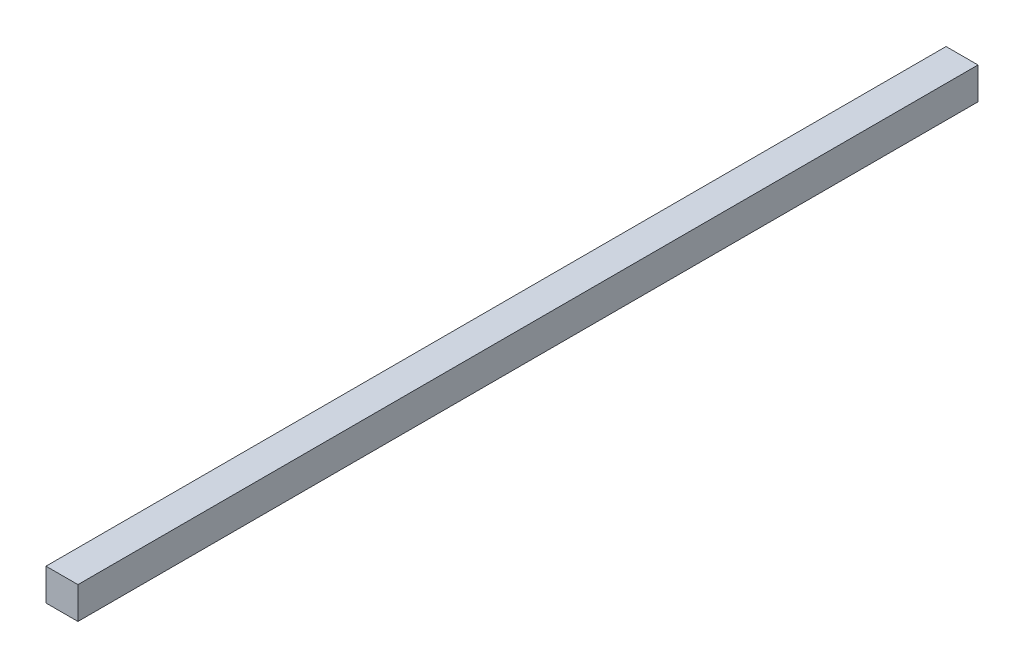
ISO-10303-21;
HEADER;
FILE_DESCRIPTION(('STEP AP214'),'2;1');
FILE_NAME('part.step','',(''),(''),'','','');
FILE_SCHEMA(('AUTOMOTIVE_DESIGN { 1 0 10303 214 1 1 1 1 }'));
ENDSEC;
DATA;
#1=APPLICATION_CONTEXT('core data for automotive mechanical design processes');
#2=APPLICATION_PROTOCOL_DEFINITION('international standard','automotive_design',2000,#1);
#3=PRODUCT_CONTEXT('',#1,'mechanical');
#4=PRODUCT('Part','Part','',(#3));
#5=PRODUCT_RELATED_PRODUCT_CATEGORY('part','',(#4));
#6=PRODUCT_DEFINITION_FORMATION('','',#4);
#7=PRODUCT_DEFINITION_CONTEXT('part definition',#1,'design');
#8=PRODUCT_DEFINITION('design','',#6,#7);
#9=PRODUCT_DEFINITION_SHAPE('','',#8);
#10=(LENGTH_UNIT() NAMED_UNIT(*) SI_UNIT(.MILLI.,.METRE.));
#11=(NAMED_UNIT(*) PLANE_ANGLE_UNIT() SI_UNIT($,.RADIAN.));
#12=(NAMED_UNIT(*) SI_UNIT($,.STERADIAN.) SOLID_ANGLE_UNIT());
#13=UNCERTAINTY_MEASURE_WITH_UNIT(LENGTH_MEASURE(1.E-05),#10,'distance_accuracy_value','');
#14=(GEOMETRIC_REPRESENTATION_CONTEXT(3) GLOBAL_UNCERTAINTY_ASSIGNED_CONTEXT((#13)) GLOBAL_UNIT_ASSIGNED_CONTEXT((#10,
#11,#12)) REPRESENTATION_CONTEXT('',''));
#15=CARTESIAN_POINT('',(0.,0.,0.));
#16=DIRECTION('',(0.,0.,1.));
#17=DIRECTION('',(1.,0.,0.));
#18=AXIS2_PLACEMENT_3D('',#15,#16,#17);
#19=CARTESIAN_POINT('',(-11.,11.,0.));
#20=DIRECTION('',(-1.,0.,0.));
#21=DIRECTION('',(0.,0.,1.));
#22=AXIS2_PLACEMENT_3D('',#19,#20,#21);
#23=PLANE('',#22);
#24=DIRECTION('',(0.,0.,1.));
#25=VECTOR('',#24,1.);
#26=CARTESIAN_POINT('',(-11.,11.,0.));
#27=LINE('',#26,#25);
#28=CARTESIAN_POINT('',(-11.,11.,-310.));
#29=VERTEX_POINT('',#28);
#30=CARTESIAN_POINT('',(-11.,11.,310.));
#31=VERTEX_POINT('',#30);
#32=EDGE_CURVE('E20',#29,#31,#27,.T.);
#33=ORIENTED_EDGE('',*,*,#32,.F.);
#34=DIRECTION('',(0.,1.,0.));
#35=VECTOR('',#34,1.);
#36=CARTESIAN_POINT('',(-11.,0.,-310.));
#37=LINE('',#36,#35);
#38=CARTESIAN_POINT('',(-11.,-11.,-310.));
#39=VERTEX_POINT('',#38);
#40=EDGE_CURVE('E81',#39,#29,#37,.T.);
#41=ORIENTED_EDGE('',*,*,#40,.F.);
#42=DIRECTION('',(0.,0.,-1.));
#43=VECTOR('',#42,1.);
#44=CARTESIAN_POINT('',(-11.,-11.,0.));
#45=LINE('',#44,#43);
#46=CARTESIAN_POINT('',(-11.,-11.,310.));
#47=VERTEX_POINT('',#46);
#48=EDGE_CURVE('E68',#47,#39,#45,.T.);
#49=ORIENTED_EDGE('',*,*,#48,.F.);
#50=DIRECTION('',(0.,1.,0.));
#51=VECTOR('',#50,1.);
#52=CARTESIAN_POINT('',(-11.,0.,310.));
#53=LINE('',#52,#51);
#54=EDGE_CURVE('E55',#31,#47,#53,.F.);
#55=ORIENTED_EDGE('',*,*,#54,.F.);
#56=EDGE_LOOP('',(#33,#41,#49,#55));
#57=FACE_BOUND('',#56,.T.);
#58=ADVANCED_FACE('F17',(#57),#23,.T.);
#59=CARTESIAN_POINT('',(11.,11.,0.));
#60=DIRECTION('',(0.,1.,0.));
#61=DIRECTION('',(0.,0.,1.));
#62=AXIS2_PLACEMENT_3D('',#59,#60,#61);
#63=PLANE('',#62);
#64=DIRECTION('',(0.,0.,-1.));
#65=VECTOR('',#64,1.);
#66=CARTESIAN_POINT('',(11.,11.,0.));
#67=LINE('',#66,#65);
#68=CARTESIAN_POINT('',(11.,11.,-310.));
#69=VERTEX_POINT('',#68);
#70=CARTESIAN_POINT('',(11.,11.,310.));
#71=VERTEX_POINT('',#70);
#72=EDGE_CURVE('E83',#69,#71,#67,.F.);
#73=ORIENTED_EDGE('',*,*,#72,.F.);
#74=DIRECTION('',(-1.,0.,0.));
#75=VECTOR('',#74,1.);
#76=CARTESIAN_POINT('',(0.,11.,-310.));
#77=LINE('',#76,#75);
#78=EDGE_CURVE('E64',#29,#69,#77,.F.);
#79=ORIENTED_EDGE('',*,*,#78,.F.);
#80=ORIENTED_EDGE('',*,*,#32,.T.);
#81=DIRECTION('',(1.,0.,0.));
#82=VECTOR('',#81,1.);
#83=CARTESIAN_POINT('',(0.,11.,310.));
#84=LINE('',#83,#82);
#85=EDGE_CURVE('E61',#71,#31,#84,.F.);
#86=ORIENTED_EDGE('',*,*,#85,.F.);
#87=EDGE_LOOP('',(#73,#79,#80,#86));
#88=FACE_BOUND('',#87,.T.);
#89=ADVANCED_FACE('F60',(#88),#63,.T.);
#90=CARTESIAN_POINT('',(0.,0.,310.));
#91=DIRECTION('',(0.,0.,1.));
#92=DIRECTION('',(1.,0.,0.));
#93=AXIS2_PLACEMENT_3D('',#90,#91,#92);
#94=PLANE('',#93);
#95=DIRECTION('',(1.,0.,0.));
#96=VECTOR('',#95,1.);
#97=CARTESIAN_POINT('',(-11.,-11.,310.));
#98=LINE('',#97,#96);
#99=CARTESIAN_POINT('',(11.,-11.,310.));
#100=VERTEX_POINT('',#99);
#101=EDGE_CURVE('E70',#100,#47,#98,.F.);
#102=ORIENTED_EDGE('',*,*,#101,.F.);
#103=DIRECTION('',(0.,1.,0.));
#104=VECTOR('',#103,1.);
#105=CARTESIAN_POINT('',(11.,-11.,310.));
#106=LINE('',#105,#104);
#107=EDGE_CURVE('E74',#71,#100,#106,.F.);
#108=ORIENTED_EDGE('',*,*,#107,.F.);
#109=ORIENTED_EDGE('',*,*,#85,.T.);
#110=ORIENTED_EDGE('',*,*,#54,.T.);
#111=EDGE_LOOP('',(#102,#108,#109,#110));
#112=FACE_BOUND('',#111,.T.);
#113=ADVANCED_FACE('F72',(#112),#94,.T.);
#114=CARTESIAN_POINT('',(-11.,-11.,0.));
#115=DIRECTION('',(0.,-1.,0.));
#116=DIRECTION('',(0.,0.,-1.));
#117=AXIS2_PLACEMENT_3D('',#114,#115,#116);
#118=PLANE('',#117);
#119=ORIENTED_EDGE('',*,*,#48,.T.);
#120=DIRECTION('',(-1.,0.,0.));
#121=VECTOR('',#120,1.);
#122=CARTESIAN_POINT('',(0.,-11.,-310.));
#123=LINE('',#122,#121);
#124=CARTESIAN_POINT('',(11.,-11.,-310.));
#125=VERTEX_POINT('',#124);
#126=EDGE_CURVE('E35',#125,#39,#123,.T.);
#127=ORIENTED_EDGE('',*,*,#126,.F.);
#128=DIRECTION('',(0.,0.,-1.));
#129=VECTOR('',#128,1.);
#130=CARTESIAN_POINT('',(11.,-11.,0.));
#131=LINE('',#130,#129);
#132=EDGE_CURVE('E26',#100,#125,#131,.T.);
#133=ORIENTED_EDGE('',*,*,#132,.F.);
#134=ORIENTED_EDGE('',*,*,#101,.T.);
#135=EDGE_LOOP('',(#119,#127,#133,#134));
#136=FACE_BOUND('',#135,.T.);
#137=ADVANCED_FACE('F89',(#136),#118,.T.);
#138=CARTESIAN_POINT('',(0.,0.,-310.));
#139=DIRECTION('',(0.,0.,-1.));
#140=DIRECTION('',(-1.,0.,0.));
#141=AXIS2_PLACEMENT_3D('',#138,#139,#140);
#142=PLANE('',#141);
#143=ORIENTED_EDGE('',*,*,#126,.T.);
#144=ORIENTED_EDGE('',*,*,#40,.T.);
#145=ORIENTED_EDGE('',*,*,#78,.T.);
#146=DIRECTION('',(0.,1.,0.));
#147=VECTOR('',#146,1.);
#148=CARTESIAN_POINT('',(11.,-11.,-310.));
#149=LINE('',#148,#147);
#150=EDGE_CURVE('E11',#125,#69,#149,.T.);
#151=ORIENTED_EDGE('',*,*,#150,.F.);
#152=EDGE_LOOP('',(#143,#144,#145,#151));
#153=FACE_BOUND('',#152,.T.);
#154=ADVANCED_FACE('F91',(#153),#142,.T.);
#155=CARTESIAN_POINT('',(11.,-11.,0.));
#156=DIRECTION('',(1.,0.,0.));
#157=DIRECTION('',(0.,0.,-1.));
#158=AXIS2_PLACEMENT_3D('',#155,#156,#157);
#159=PLANE('',#158);
#160=ORIENTED_EDGE('',*,*,#132,.T.);
#161=ORIENTED_EDGE('',*,*,#150,.T.);
#162=ORIENTED_EDGE('',*,*,#72,.T.);
#163=ORIENTED_EDGE('',*,*,#107,.T.);
#164=EDGE_LOOP('',(#160,#161,#162,#163));
#165=FACE_BOUND('',#164,.T.);
#166=ADVANCED_FACE('F88',(#165),#159,.T.);
#167=CLOSED_SHELL('',(#58,#89,#113,#137,#154,#166));
#168=MANIFOLD_SOLID_BREP('B1',#167);
#169=ADVANCED_BREP_SHAPE_REPRESENTATION('',(#18,#168),#14);
#170=SHAPE_DEFINITION_REPRESENTATION(#9,#169);
ENDSEC;
END-ISO-10303-21;
